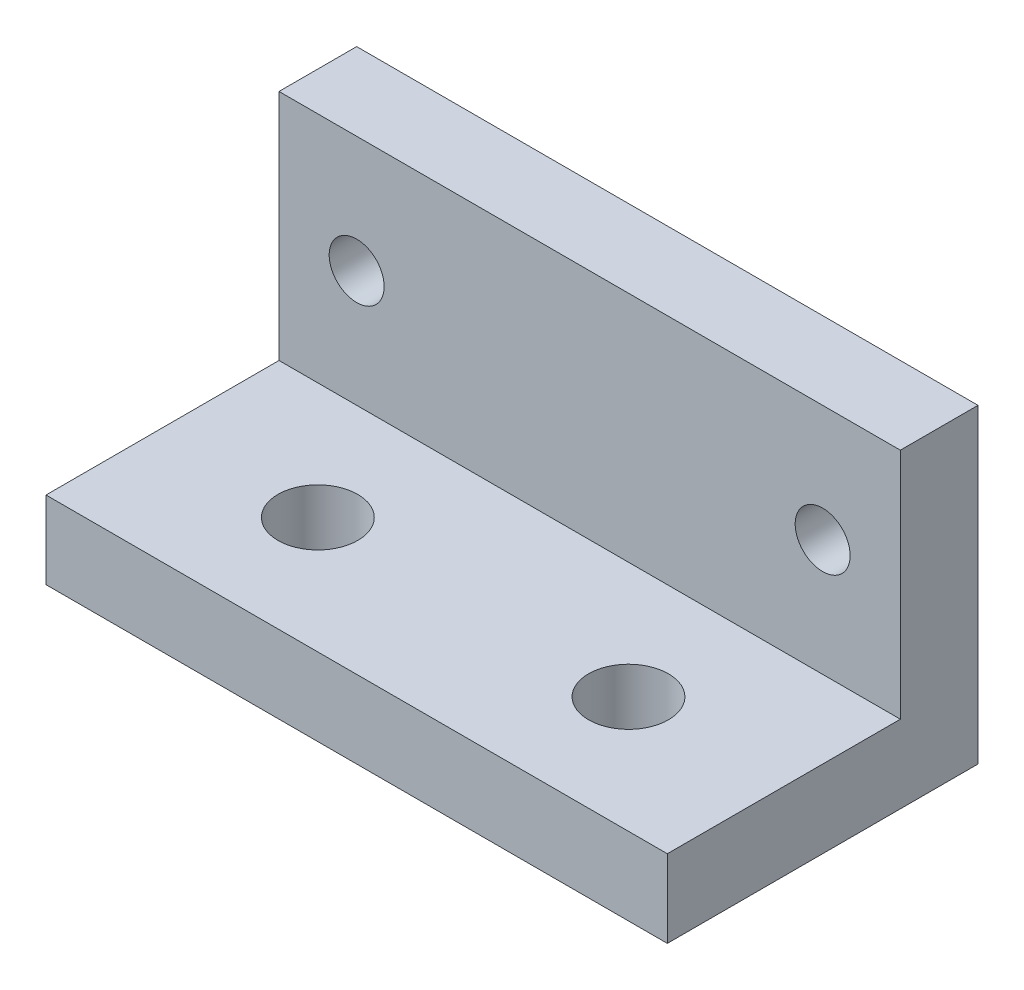
ISO-10303-21;
HEADER;
FILE_DESCRIPTION(('STEP AP214'),'2;1');
FILE_NAME('part.step','',(''),(''),'','','');
FILE_SCHEMA(('AUTOMOTIVE_DESIGN { 1 0 10303 214 1 1 1 1 }'));
ENDSEC;
DATA;
#1=APPLICATION_CONTEXT('core data for automotive mechanical design processes');
#2=APPLICATION_PROTOCOL_DEFINITION('international standard','automotive_design',2000,#1);
#3=PRODUCT_CONTEXT('',#1,'mechanical');
#4=PRODUCT('Part','Part','',(#3));
#5=PRODUCT_RELATED_PRODUCT_CATEGORY('part','',(#4));
#6=PRODUCT_DEFINITION_FORMATION('','',#4);
#7=PRODUCT_DEFINITION_CONTEXT('part definition',#1,'design');
#8=PRODUCT_DEFINITION('design','',#6,#7);
#9=PRODUCT_DEFINITION_SHAPE('','',#8);
#10=(LENGTH_UNIT() NAMED_UNIT(*) SI_UNIT(.MILLI.,.METRE.));
#11=(NAMED_UNIT(*) PLANE_ANGLE_UNIT() SI_UNIT($,.RADIAN.));
#12=(NAMED_UNIT(*) SI_UNIT($,.STERADIAN.) SOLID_ANGLE_UNIT());
#13=UNCERTAINTY_MEASURE_WITH_UNIT(LENGTH_MEASURE(1.E-05),#10,'distance_accuracy_value','');
#14=(GEOMETRIC_REPRESENTATION_CONTEXT(3) GLOBAL_UNCERTAINTY_ASSIGNED_CONTEXT((#13)) GLOBAL_UNIT_ASSIGNED_CONTEXT((#10,
#11,#12)) REPRESENTATION_CONTEXT('',''));
#15=CARTESIAN_POINT('',(0.,0.,0.));
#16=DIRECTION('',(0.,0.,1.));
#17=DIRECTION('',(1.,0.,0.));
#18=AXIS2_PLACEMENT_3D('',#15,#16,#17);
#19=CARTESIAN_POINT('',(25.4,0.,25.4));
#20=DIRECTION('',(0.,1.,0.));
#21=DIRECTION('',(0.,0.,1.));
#22=AXIS2_PLACEMENT_3D('',#19,#20,#21);
#23=PLANE('',#22);
#24=CARTESIAN_POINT('',(-12.7,0.,15.875));
#25=DIRECTION('',(0.,1.,0.));
#26=DIRECTION('',(0.,0.,1.));
#27=AXIS2_PLACEMENT_3D('',#24,#25,#26);
#28=CIRCLE('',#27,3.26389999999999);
#29=CARTESIAN_POINT('',(-12.7,0.,19.1389));
#30=VERTEX_POINT('',#29);
#31=EDGE_CURVE('E164',#30,#30,#28,.T.);
#32=ORIENTED_EDGE('',*,*,#31,.T.);
#33=EDGE_LOOP('',(#32));
#34=FACE_BOUND('',#33,.T.);
#35=CARTESIAN_POINT('',(12.7,0.,15.875));
#36=DIRECTION('',(0.,1.,0.));
#37=DIRECTION('',(0.,0.,1.));
#38=AXIS2_PLACEMENT_3D('',#35,#36,#37);
#39=CIRCLE('',#38,3.2639);
#40=CARTESIAN_POINT('',(12.7,0.,19.1389));
#41=VERTEX_POINT('',#40);
#42=EDGE_CURVE('E121',#41,#41,#39,.T.);
#43=ORIENTED_EDGE('',*,*,#42,.T.);
#44=EDGE_LOOP('',(#43));
#45=FACE_BOUND('',#44,.T.);
#46=DIRECTION('',(0.,0.,-1.));
#47=VECTOR('',#46,1.);
#48=CARTESIAN_POINT('',(-25.4,0.,25.4));
#49=LINE('',#48,#47);
#50=CARTESIAN_POINT('',(-25.4,0.,25.4));
#51=VERTEX_POINT('',#50);
#52=CARTESIAN_POINT('',(-25.4,0.,0.));
#53=VERTEX_POINT('',#52);
#54=EDGE_CURVE('E117',#51,#53,#49,.T.);
#55=ORIENTED_EDGE('',*,*,#54,.T.);
#56=DIRECTION('',(-1.,0.,0.));
#57=VECTOR('',#56,1.);
#58=CARTESIAN_POINT('',(25.4,0.,0.));
#59=LINE('',#58,#57);
#60=CARTESIAN_POINT('',(25.4,0.,0.));
#61=VERTEX_POINT('',#60);
#62=EDGE_CURVE('E11',#61,#53,#59,.T.);
#63=ORIENTED_EDGE('',*,*,#62,.F.);
#64=DIRECTION('',(0.,0.,-1.));
#65=VECTOR('',#64,1.);
#66=CARTESIAN_POINT('',(25.4,0.,25.4));
#67=LINE('',#66,#65);
#68=CARTESIAN_POINT('',(25.4,0.,25.4));
#69=VERTEX_POINT('',#68);
#70=EDGE_CURVE('E128',#69,#61,#67,.T.);
#71=ORIENTED_EDGE('',*,*,#70,.F.);
#72=DIRECTION('',(-1.,0.,0.));
#73=VECTOR('',#72,1.);
#74=CARTESIAN_POINT('',(25.4,0.,25.4));
#75=LINE('',#74,#73);
#76=EDGE_CURVE('E113',#69,#51,#75,.T.);
#77=ORIENTED_EDGE('',*,*,#76,.T.);
#78=EDGE_LOOP('',(#55,#63,#71,#77));
#79=FACE_BOUND('',#78,.T.);
#80=ADVANCED_FACE('F33',(#34,#45,#79),#23,.F.);
#81=CARTESIAN_POINT('',(25.4,0.,0.));
#82=DIRECTION('',(0.,0.,1.));
#83=DIRECTION('',(1.,0.,0.));
#84=AXIS2_PLACEMENT_3D('',#81,#82,#83);
#85=PLANE('',#84);
#86=CARTESIAN_POINT('',(-19.05,15.875,0.));
#87=DIRECTION('',(0.,0.,1.));
#88=DIRECTION('',(1.,0.,0.));
#89=AXIS2_PLACEMENT_3D('',#86,#87,#88);
#90=CIRCLE('',#89,2.24789999999999);
#91=CARTESIAN_POINT('',(-16.8021,15.875,0.));
#92=VERTEX_POINT('',#91);
#93=EDGE_CURVE('E185',#92,#92,#90,.T.);
#94=ORIENTED_EDGE('',*,*,#93,.T.);
#95=EDGE_LOOP('',(#94));
#96=FACE_BOUND('',#95,.T.);
#97=CARTESIAN_POINT('',(19.05,15.875,0.));
#98=DIRECTION('',(0.,0.,1.));
#99=DIRECTION('',(1.,0.,0.));
#100=AXIS2_PLACEMENT_3D('',#97,#98,#99);
#101=CIRCLE('',#100,2.24789999999999);
#102=CARTESIAN_POINT('',(21.2979,15.875,0.));
#103=VERTEX_POINT('',#102);
#104=EDGE_CURVE('E179',#103,#103,#101,.T.);
#105=ORIENTED_EDGE('',*,*,#104,.T.);
#106=EDGE_LOOP('',(#105));
#107=FACE_BOUND('',#106,.T.);
#108=DIRECTION('',(0.,1.,0.));
#109=VECTOR('',#108,1.);
#110=CARTESIAN_POINT('',(-25.4,0.,0.));
#111=LINE('',#110,#109);
#112=CARTESIAN_POINT('',(-25.4,25.4,0.));
#113=VERTEX_POINT('',#112);
#114=EDGE_CURVE('E120',#53,#113,#111,.T.);
#115=ORIENTED_EDGE('',*,*,#114,.T.);
#116=DIRECTION('',(-1.,0.,0.));
#117=VECTOR('',#116,1.);
#118=CARTESIAN_POINT('',(25.4,25.4,0.));
#119=LINE('',#118,#117);
#120=CARTESIAN_POINT('',(25.4,25.4,0.));
#121=VERTEX_POINT('',#120);
#122=EDGE_CURVE('E41',#121,#113,#119,.T.);
#123=ORIENTED_EDGE('',*,*,#122,.F.);
#124=DIRECTION('',(0.,1.,0.));
#125=VECTOR('',#124,1.);
#126=CARTESIAN_POINT('',(25.4,0.,0.));
#127=LINE('',#126,#125);
#128=EDGE_CURVE('E86',#61,#121,#127,.T.);
#129=ORIENTED_EDGE('',*,*,#128,.F.);
#130=ORIENTED_EDGE('',*,*,#62,.T.);
#131=EDGE_LOOP('',(#115,#123,#129,#130));
#132=FACE_BOUND('',#131,.T.);
#133=ADVANCED_FACE('F154',(#96,#107,#132),#85,.F.);
#134=CARTESIAN_POINT('',(25.4,25.4,0.));
#135=DIRECTION('',(0.,-1.,0.));
#136=DIRECTION('',(0.,0.,-1.));
#137=AXIS2_PLACEMENT_3D('',#134,#135,#136);
#138=PLANE('',#137);
#139=DIRECTION('',(0.,0.,1.));
#140=VECTOR('',#139,1.);
#141=CARTESIAN_POINT('',(-25.4,25.4,0.));
#142=LINE('',#141,#140);
#143=CARTESIAN_POINT('',(-25.4,25.4,6.35));
#144=VERTEX_POINT('',#143);
#145=EDGE_CURVE('E123',#113,#144,#142,.T.);
#146=ORIENTED_EDGE('',*,*,#145,.T.);
#147=DIRECTION('',(-1.,0.,0.));
#148=VECTOR('',#147,1.);
#149=CARTESIAN_POINT('',(25.4,25.4,6.35));
#150=LINE('',#149,#148);
#151=CARTESIAN_POINT('',(25.4,25.4,6.35));
#152=VERTEX_POINT('',#151);
#153=EDGE_CURVE('E108',#152,#144,#150,.T.);
#154=ORIENTED_EDGE('',*,*,#153,.F.);
#155=DIRECTION('',(0.,0.,1.));
#156=VECTOR('',#155,1.);
#157=CARTESIAN_POINT('',(25.4,25.4,0.));
#158=LINE('',#157,#156);
#159=EDGE_CURVE('E99',#121,#152,#158,.T.);
#160=ORIENTED_EDGE('',*,*,#159,.F.);
#161=ORIENTED_EDGE('',*,*,#122,.T.);
#162=EDGE_LOOP('',(#146,#154,#160,#161));
#163=FACE_BOUND('',#162,.T.);
#164=ADVANCED_FACE('F134',(#163),#138,.F.);
#165=CARTESIAN_POINT('',(25.4,25.4,6.35));
#166=DIRECTION('',(0.,0.,-1.));
#167=DIRECTION('',(0.,1.,0.));
#168=AXIS2_PLACEMENT_3D('',#165,#166,#167);
#169=PLANE('',#168);
#170=CARTESIAN_POINT('',(-19.05,15.875,6.35));
#171=DIRECTION('',(0.,0.,1.));
#172=DIRECTION('',(1.,0.,0.));
#173=AXIS2_PLACEMENT_3D('',#170,#171,#172);
#174=CIRCLE('',#173,2.24789999999999);
#175=CARTESIAN_POINT('',(-16.8021,15.875,6.35));
#176=VERTEX_POINT('',#175);
#177=EDGE_CURVE('E188',#176,#176,#174,.T.);
#178=ORIENTED_EDGE('',*,*,#177,.F.);
#179=EDGE_LOOP('',(#178));
#180=FACE_BOUND('',#179,.T.);
#181=CARTESIAN_POINT('',(19.05,15.875,6.35));
#182=DIRECTION('',(0.,0.,1.));
#183=DIRECTION('',(1.,0.,0.));
#184=AXIS2_PLACEMENT_3D('',#181,#182,#183);
#185=CIRCLE('',#184,2.24789999999999);
#186=CARTESIAN_POINT('',(21.2979,15.875,6.35));
#187=VERTEX_POINT('',#186);
#188=EDGE_CURVE('E182',#187,#187,#185,.T.);
#189=ORIENTED_EDGE('',*,*,#188,.F.);
#190=EDGE_LOOP('',(#189));
#191=FACE_BOUND('',#190,.T.);
#192=DIRECTION('',(0.,-1.,0.));
#193=VECTOR('',#192,1.);
#194=CARTESIAN_POINT('',(-25.4,25.4,6.35));
#195=LINE('',#194,#193);
#196=CARTESIAN_POINT('',(-25.4,6.34999999999999,6.35));
#197=VERTEX_POINT('',#196);
#198=EDGE_CURVE('E107',#144,#197,#195,.T.);
#199=ORIENTED_EDGE('',*,*,#198,.T.);
#200=DIRECTION('',(-1.,0.,0.));
#201=VECTOR('',#200,1.);
#202=CARTESIAN_POINT('',(25.4,6.34999999999999,6.35));
#203=LINE('',#202,#201);
#204=CARTESIAN_POINT('',(25.4,6.34999999999999,6.35));
#205=VERTEX_POINT('',#204);
#206=EDGE_CURVE('E104',#205,#197,#203,.T.);
#207=ORIENTED_EDGE('',*,*,#206,.F.);
#208=DIRECTION('',(0.,-1.,0.));
#209=VECTOR('',#208,1.);
#210=CARTESIAN_POINT('',(25.4,25.4,6.35));
#211=LINE('',#210,#209);
#212=EDGE_CURVE('E93',#152,#205,#211,.T.);
#213=ORIENTED_EDGE('',*,*,#212,.F.);
#214=ORIENTED_EDGE('',*,*,#153,.T.);
#215=EDGE_LOOP('',(#199,#207,#213,#214));
#216=FACE_BOUND('',#215,.T.);
#217=ADVANCED_FACE('F105',(#180,#191,#216),#169,.F.);
#218=CARTESIAN_POINT('',(25.4,6.34999999999999,6.35));
#219=DIRECTION('',(0.,-1.,0.));
#220=DIRECTION('',(0.,0.,-1.));
#221=AXIS2_PLACEMENT_3D('',#218,#219,#220);
#222=PLANE('',#221);
#223=CARTESIAN_POINT('',(-12.7,6.35,15.875));
#224=DIRECTION('',(0.,1.,0.));
#225=DIRECTION('',(0.,0.,1.));
#226=AXIS2_PLACEMENT_3D('',#223,#224,#225);
#227=CIRCLE('',#226,3.26389999999999);
#228=CARTESIAN_POINT('',(-12.7,6.35,19.1389));
#229=VERTEX_POINT('',#228);
#230=EDGE_CURVE('E176',#229,#229,#227,.T.);
#231=ORIENTED_EDGE('',*,*,#230,.F.);
#232=EDGE_LOOP('',(#231));
#233=FACE_BOUND('',#232,.T.);
#234=CARTESIAN_POINT('',(12.7,6.35,15.875));
#235=DIRECTION('',(0.,1.,0.));
#236=DIRECTION('',(0.,0.,1.));
#237=AXIS2_PLACEMENT_3D('',#234,#235,#236);
#238=CIRCLE('',#237,3.26389999999999);
#239=CARTESIAN_POINT('',(12.7,6.35,19.1389));
#240=VERTEX_POINT('',#239);
#241=EDGE_CURVE('E168',#240,#240,#238,.T.);
#242=ORIENTED_EDGE('',*,*,#241,.F.);
#243=EDGE_LOOP('',(#242));
#244=FACE_BOUND('',#243,.T.);
#245=DIRECTION('',(0.,0.,1.));
#246=VECTOR('',#245,1.);
#247=CARTESIAN_POINT('',(-25.4,6.34999999999999,6.35));
#248=LINE('',#247,#246);
#249=CARTESIAN_POINT('',(-25.4,6.35,25.4));
#250=VERTEX_POINT('',#249);
#251=EDGE_CURVE('E72',#197,#250,#248,.T.);
#252=ORIENTED_EDGE('',*,*,#251,.T.);
#253=DIRECTION('',(-1.,0.,0.));
#254=VECTOR('',#253,1.);
#255=CARTESIAN_POINT('',(25.4,6.35,25.4));
#256=LINE('',#255,#254);
#257=CARTESIAN_POINT('',(25.4,6.35,25.4));
#258=VERTEX_POINT('',#257);
#259=EDGE_CURVE('E109',#258,#250,#256,.T.);
#260=ORIENTED_EDGE('',*,*,#259,.F.);
#261=DIRECTION('',(0.,0.,1.));
#262=VECTOR('',#261,1.);
#263=CARTESIAN_POINT('',(25.4,6.34999999999999,6.35));
#264=LINE('',#263,#262);
#265=EDGE_CURVE('E97',#205,#258,#264,.T.);
#266=ORIENTED_EDGE('',*,*,#265,.F.);
#267=ORIENTED_EDGE('',*,*,#206,.T.);
#268=EDGE_LOOP('',(#252,#260,#266,#267));
#269=FACE_BOUND('',#268,.T.);
#270=ADVANCED_FACE('F111',(#233,#244,#269),#222,.F.);
#271=CARTESIAN_POINT('',(25.4,6.35,25.4));
#272=DIRECTION('',(0.,0.,-1.));
#273=DIRECTION('',(-1.,0.,0.));
#274=AXIS2_PLACEMENT_3D('',#271,#272,#273);
#275=PLANE('',#274);
#276=DIRECTION('',(0.,-1.,0.));
#277=VECTOR('',#276,1.);
#278=CARTESIAN_POINT('',(-25.4,6.35,25.4));
#279=LINE('',#278,#277);
#280=EDGE_CURVE('E78',#250,#51,#279,.T.);
#281=ORIENTED_EDGE('',*,*,#280,.T.);
#282=ORIENTED_EDGE('',*,*,#76,.F.);
#283=DIRECTION('',(0.,-1.,0.));
#284=VECTOR('',#283,1.);
#285=CARTESIAN_POINT('',(25.4,6.35,25.4));
#286=LINE('',#285,#284);
#287=EDGE_CURVE('E49',#258,#69,#286,.T.);
#288=ORIENTED_EDGE('',*,*,#287,.F.);
#289=ORIENTED_EDGE('',*,*,#259,.T.);
#290=EDGE_LOOP('',(#281,#282,#288,#289));
#291=FACE_BOUND('',#290,.T.);
#292=ADVANCED_FACE('F141',(#291),#275,.F.);
#293=CARTESIAN_POINT('',(25.4,0.,0.));
#294=DIRECTION('',(1.,0.,0.));
#295=DIRECTION('',(0.,0.,-1.));
#296=AXIS2_PLACEMENT_3D('',#293,#294,#295);
#297=PLANE('',#296);
#298=ORIENTED_EDGE('',*,*,#70,.T.);
#299=ORIENTED_EDGE('',*,*,#128,.T.);
#300=ORIENTED_EDGE('',*,*,#159,.T.);
#301=ORIENTED_EDGE('',*,*,#212,.T.);
#302=ORIENTED_EDGE('',*,*,#265,.T.);
#303=ORIENTED_EDGE('',*,*,#287,.T.);
#304=EDGE_LOOP('',(#298,#299,#300,#301,#302,#303));
#305=FACE_BOUND('',#304,.T.);
#306=ADVANCED_FACE('F95',(#305),#297,.T.);
#307=CARTESIAN_POINT('',(-25.4,0.,0.));
#308=DIRECTION('',(1.,0.,0.));
#309=DIRECTION('',(0.,0.,-1.));
#310=AXIS2_PLACEMENT_3D('',#307,#308,#309);
#311=PLANE('',#310);
#312=ORIENTED_EDGE('',*,*,#54,.F.);
#313=ORIENTED_EDGE('',*,*,#280,.F.);
#314=ORIENTED_EDGE('',*,*,#251,.F.);
#315=ORIENTED_EDGE('',*,*,#198,.F.);
#316=ORIENTED_EDGE('',*,*,#145,.F.);
#317=ORIENTED_EDGE('',*,*,#114,.F.);
#318=EDGE_LOOP('',(#312,#313,#314,#315,#316,#317));
#319=FACE_BOUND('',#318,.T.);
#320=ADVANCED_FACE('F137',(#319),#311,.F.);
#321=CARTESIAN_POINT('',(12.7,6.35,15.875));
#322=DIRECTION('',(0.,1.,0.));
#323=DIRECTION('',(0.,0.,1.));
#324=AXIS2_PLACEMENT_3D('',#321,#322,#323);
#325=CYLINDRICAL_SURFACE('',#324,3.2639);
#326=ORIENTED_EDGE('',*,*,#42,.F.);
#327=EDGE_LOOP('',(#326));
#328=FACE_BOUND('',#327,.T.);
#329=ORIENTED_EDGE('',*,*,#241,.T.);
#330=EDGE_LOOP('',(#329));
#331=FACE_BOUND('',#330,.T.);
#332=ADVANCED_FACE('F210',(#328,#331),#325,.F.);
#333=CARTESIAN_POINT('',(-12.7,6.35,15.875));
#334=DIRECTION('',(0.,1.,0.));
#335=DIRECTION('',(0.,0.,1.));
#336=AXIS2_PLACEMENT_3D('',#333,#334,#335);
#337=CYLINDRICAL_SURFACE('',#336,3.26389999999999);
#338=ORIENTED_EDGE('',*,*,#31,.F.);
#339=EDGE_LOOP('',(#338));
#340=FACE_BOUND('',#339,.T.);
#341=ORIENTED_EDGE('',*,*,#230,.T.);
#342=EDGE_LOOP('',(#341));
#343=FACE_BOUND('',#342,.T.);
#344=ADVANCED_FACE('F201',(#340,#343),#337,.F.);
#345=CARTESIAN_POINT('',(19.05,15.875,6.35));
#346=DIRECTION('',(0.,0.,1.));
#347=DIRECTION('',(1.,0.,0.));
#348=AXIS2_PLACEMENT_3D('',#345,#346,#347);
#349=CYLINDRICAL_SURFACE('',#348,2.24789999999999);
#350=ORIENTED_EDGE('',*,*,#104,.F.);
#351=EDGE_LOOP('',(#350));
#352=FACE_BOUND('',#351,.T.);
#353=ORIENTED_EDGE('',*,*,#188,.T.);
#354=EDGE_LOOP('',(#353));
#355=FACE_BOUND('',#354,.T.);
#356=ADVANCED_FACE('F199',(#352,#355),#349,.F.);
#357=CARTESIAN_POINT('',(-19.05,15.875,6.35));
#358=DIRECTION('',(0.,0.,1.));
#359=DIRECTION('',(1.,0.,0.));
#360=AXIS2_PLACEMENT_3D('',#357,#358,#359);
#361=CYLINDRICAL_SURFACE('',#360,2.24789999999999);
#362=ORIENTED_EDGE('',*,*,#93,.F.);
#363=EDGE_LOOP('',(#362));
#364=FACE_BOUND('',#363,.T.);
#365=ORIENTED_EDGE('',*,*,#177,.T.);
#366=EDGE_LOOP('',(#365));
#367=FACE_BOUND('',#366,.T.);
#368=ADVANCED_FACE('F192',(#364,#367),#361,.F.);
#369=CLOSED_SHELL('',(#80,#133,#164,#217,#270,#292,#306,#320,#332,#344,#356,#368));
#370=MANIFOLD_SOLID_BREP('B2',#369);
#371=ADVANCED_BREP_SHAPE_REPRESENTATION('',(#18,#370),#14);
#372=SHAPE_DEFINITION_REPRESENTATION(#9,#371);
ENDSEC;
END-ISO-10303-21;
